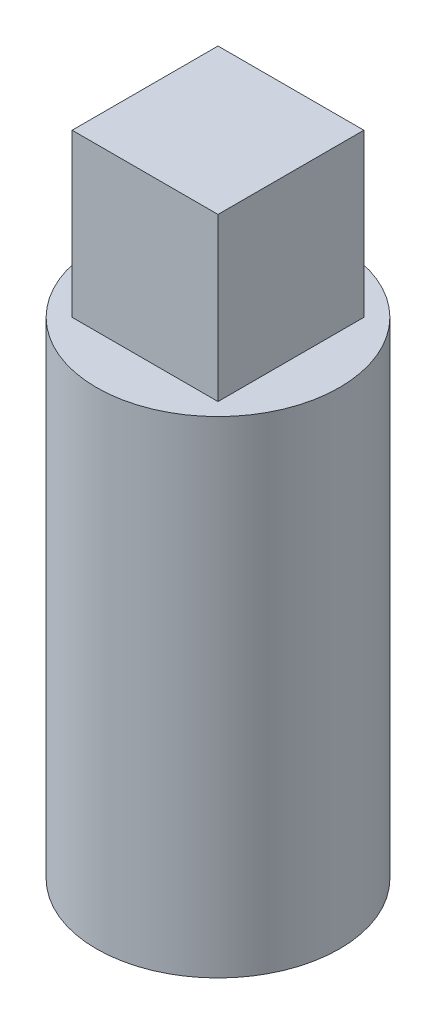
ISO-10303-21;
HEADER;
FILE_DESCRIPTION(('STEP AP214'),'2;1');
FILE_NAME('part.step','',(''),(''),'','','');
FILE_SCHEMA(('AUTOMOTIVE_DESIGN { 1 0 10303 214 1 1 1 1 }'));
ENDSEC;
DATA;
#1=APPLICATION_CONTEXT('core data for automotive mechanical design processes');
#2=APPLICATION_PROTOCOL_DEFINITION('international standard','automotive_design',2000,#1);
#3=PRODUCT_CONTEXT('',#1,'mechanical');
#4=PRODUCT('Part','Part','',(#3));
#5=PRODUCT_RELATED_PRODUCT_CATEGORY('part','',(#4));
#6=PRODUCT_DEFINITION_FORMATION('','',#4);
#7=PRODUCT_DEFINITION_CONTEXT('part definition',#1,'design');
#8=PRODUCT_DEFINITION('design','',#6,#7);
#9=PRODUCT_DEFINITION_SHAPE('','',#8);
#10=(LENGTH_UNIT() NAMED_UNIT(*) SI_UNIT(.MILLI.,.METRE.));
#11=(NAMED_UNIT(*) PLANE_ANGLE_UNIT() SI_UNIT($,.RADIAN.));
#12=(NAMED_UNIT(*) SI_UNIT($,.STERADIAN.) SOLID_ANGLE_UNIT());
#13=UNCERTAINTY_MEASURE_WITH_UNIT(LENGTH_MEASURE(1.E-05),#10,'distance_accuracy_value','');
#14=(GEOMETRIC_REPRESENTATION_CONTEXT(3) GLOBAL_UNCERTAINTY_ASSIGNED_CONTEXT((#13)) GLOBAL_UNIT_ASSIGNED_CONTEXT((#10,
#11,#12)) REPRESENTATION_CONTEXT('',''));
#15=CARTESIAN_POINT('',(0.,0.,0.));
#16=DIRECTION('',(0.,0.,1.));
#17=DIRECTION('',(1.,0.,0.));
#18=AXIS2_PLACEMENT_3D('',#15,#16,#17);
#19=CARTESIAN_POINT('',(0.,6.,0.));
#20=DIRECTION('',(0.,-1.,0.));
#21=DIRECTION('',(0.,0.,-1.));
#22=AXIS2_PLACEMENT_3D('',#19,#20,#21);
#23=CYLINDRICAL_SURFACE('',#22,1.5);
#24=CARTESIAN_POINT('',(0.,6.,0.));
#25=DIRECTION('',(0.,1.,0.));
#26=DIRECTION('',(0.,0.,1.));
#27=AXIS2_PLACEMENT_3D('',#24,#25,#26);
#28=CIRCLE('',#27,1.5);
#29=CARTESIAN_POINT('',(0.,6.,1.5));
#30=VERTEX_POINT('',#29);
#31=EDGE_CURVE('E11',#30,#30,#28,.T.);
#32=ORIENTED_EDGE('',*,*,#31,.F.);
#33=EDGE_LOOP('',(#32));
#34=FACE_BOUND('',#33,.T.);
#35=CARTESIAN_POINT('',(0.,0.,0.));
#36=DIRECTION('',(0.,1.,0.));
#37=DIRECTION('',(0.,0.,1.));
#38=AXIS2_PLACEMENT_3D('',#35,#36,#37);
#39=CIRCLE('',#38,1.5);
#40=CARTESIAN_POINT('',(0.,0.,1.5));
#41=VERTEX_POINT('',#40);
#42=EDGE_CURVE('E50',#41,#41,#39,.T.);
#43=ORIENTED_EDGE('',*,*,#42,.T.);
#44=EDGE_LOOP('',(#43));
#45=FACE_BOUND('',#44,.T.);
#46=ADVANCED_FACE('F47',(#34,#45),#23,.T.);
#47=CARTESIAN_POINT('',(0.,6.,0.));
#48=DIRECTION('',(0.,1.,0.));
#49=DIRECTION('',(0.,0.,1.));
#50=AXIS2_PLACEMENT_3D('',#47,#48,#49);
#51=PLANE('',#50);
#52=DIRECTION('',(1.,0.,0.));
#53=VECTOR('',#52,1.);
#54=CARTESIAN_POINT('',(0.,6.,0.9));
#55=LINE('',#54,#53);
#56=CARTESIAN_POINT('',(-0.9,6.,0.9));
#57=VERTEX_POINT('',#56);
#58=CARTESIAN_POINT('',(0.9,6.,0.9));
#59=VERTEX_POINT('',#58);
#60=EDGE_CURVE('E62',#57,#59,#55,.T.);
#61=ORIENTED_EDGE('',*,*,#60,.F.);
#62=DIRECTION('',(0.,0.,-1.));
#63=VECTOR('',#62,1.);
#64=CARTESIAN_POINT('',(-0.9,6.,0.));
#65=LINE('',#64,#63);
#66=CARTESIAN_POINT('',(-0.9,6.,-0.9));
#67=VERTEX_POINT('',#66);
#68=EDGE_CURVE('E67',#57,#67,#65,.T.);
#69=ORIENTED_EDGE('',*,*,#68,.T.);
#70=DIRECTION('',(-1.,0.,0.));
#71=VECTOR('',#70,1.);
#72=CARTESIAN_POINT('',(0.,6.,-0.9));
#73=LINE('',#72,#71);
#74=CARTESIAN_POINT('',(0.9,6.,-0.9));
#75=VERTEX_POINT('',#74);
#76=EDGE_CURVE('E125',#75,#67,#73,.T.);
#77=ORIENTED_EDGE('',*,*,#76,.F.);
#78=DIRECTION('',(0.,0.,-1.));
#79=VECTOR('',#78,1.);
#80=CARTESIAN_POINT('',(0.9,6.,0.));
#81=LINE('',#80,#79);
#82=EDGE_CURVE('E129',#59,#75,#81,.T.);
#83=ORIENTED_EDGE('',*,*,#82,.F.);
#84=EDGE_LOOP('',(#61,#69,#77,#83));
#85=FACE_BOUND('',#84,.T.);
#86=ORIENTED_EDGE('',*,*,#31,.T.);
#87=EDGE_LOOP('',(#86));
#88=FACE_BOUND('',#87,.T.);
#89=ADVANCED_FACE('F151',(#85,#88),#51,.T.);
#90=CARTESIAN_POINT('',(0.,0.,0.));
#91=DIRECTION('',(0.,1.,0.));
#92=DIRECTION('',(0.,0.,1.));
#93=AXIS2_PLACEMENT_3D('',#90,#91,#92);
#94=PLANE('',#93);
#95=ORIENTED_EDGE('',*,*,#42,.F.);
#96=EDGE_LOOP('',(#95));
#97=FACE_BOUND('',#96,.T.);
#98=ADVANCED_FACE('F157',(#97),#94,.F.);
#99=CARTESIAN_POINT('',(0.,8.,0.9));
#100=DIRECTION('',(0.,0.,-1.));
#101=DIRECTION('',(-1.,0.,0.));
#102=AXIS2_PLACEMENT_3D('',#99,#100,#101);
#103=PLANE('',#102);
#104=ORIENTED_EDGE('',*,*,#60,.T.);
#105=DIRECTION('',(0.,-1.,0.));
#106=VECTOR('',#105,1.);
#107=CARTESIAN_POINT('',(0.9,8.,0.9));
#108=LINE('',#107,#106);
#109=CARTESIAN_POINT('',(0.9,8.,0.9));
#110=VERTEX_POINT('',#109);
#111=EDGE_CURVE('E92',#110,#59,#108,.T.);
#112=ORIENTED_EDGE('',*,*,#111,.F.);
#113=DIRECTION('',(1.,0.,0.));
#114=VECTOR('',#113,1.);
#115=CARTESIAN_POINT('',(0.,8.,0.9));
#116=LINE('',#115,#114);
#117=CARTESIAN_POINT('',(-0.9,8.,0.9));
#118=VERTEX_POINT('',#117);
#119=EDGE_CURVE('E99',#118,#110,#116,.T.);
#120=ORIENTED_EDGE('',*,*,#119,.F.);
#121=DIRECTION('',(0.,-1.,0.));
#122=VECTOR('',#121,1.);
#123=CARTESIAN_POINT('',(-0.9,8.,0.9));
#124=LINE('',#123,#122);
#125=EDGE_CURVE('E120',#118,#57,#124,.T.);
#126=ORIENTED_EDGE('',*,*,#125,.T.);
#127=EDGE_LOOP('',(#104,#112,#120,#126));
#128=FACE_BOUND('',#127,.T.);
#129=ADVANCED_FACE('F109',(#128),#103,.F.);
#130=CARTESIAN_POINT('',(0.9,8.,0.));
#131=DIRECTION('',(-1.,0.,0.));
#132=DIRECTION('',(0.,0.,1.));
#133=AXIS2_PLACEMENT_3D('',#130,#131,#132);
#134=PLANE('',#133);
#135=ORIENTED_EDGE('',*,*,#82,.T.);
#136=DIRECTION('',(0.,-1.,0.));
#137=VECTOR('',#136,1.);
#138=CARTESIAN_POINT('',(0.9,8.,-0.9));
#139=LINE('',#138,#137);
#140=CARTESIAN_POINT('',(0.9,8.,-0.9));
#141=VERTEX_POINT('',#140);
#142=EDGE_CURVE('E94',#141,#75,#139,.T.);
#143=ORIENTED_EDGE('',*,*,#142,.F.);
#144=DIRECTION('',(0.,0.,-1.));
#145=VECTOR('',#144,1.);
#146=CARTESIAN_POINT('',(0.9,8.,0.));
#147=LINE('',#146,#145);
#148=EDGE_CURVE('E87',#110,#141,#147,.T.);
#149=ORIENTED_EDGE('',*,*,#148,.F.);
#150=ORIENTED_EDGE('',*,*,#111,.T.);
#151=EDGE_LOOP('',(#135,#143,#149,#150));
#152=FACE_BOUND('',#151,.T.);
#153=ADVANCED_FACE('F90',(#152),#134,.F.);
#154=CARTESIAN_POINT('',(0.,8.,-0.9));
#155=DIRECTION('',(0.,0.,1.));
#156=DIRECTION('',(1.,0.,0.));
#157=AXIS2_PLACEMENT_3D('',#154,#155,#156);
#158=PLANE('',#157);
#159=ORIENTED_EDGE('',*,*,#76,.T.);
#160=DIRECTION('',(0.,-1.,0.));
#161=VECTOR('',#160,1.);
#162=CARTESIAN_POINT('',(-0.9,8.,-0.9));
#163=LINE('',#162,#161);
#164=CARTESIAN_POINT('',(-0.9,8.,-0.9));
#165=VERTEX_POINT('',#164);
#166=EDGE_CURVE('E115',#165,#67,#163,.T.);
#167=ORIENTED_EDGE('',*,*,#166,.F.);
#168=DIRECTION('',(-1.,0.,0.));
#169=VECTOR('',#168,1.);
#170=CARTESIAN_POINT('',(0.,8.,-0.9));
#171=LINE('',#170,#169);
#172=EDGE_CURVE('E98',#141,#165,#171,.T.);
#173=ORIENTED_EDGE('',*,*,#172,.F.);
#174=ORIENTED_EDGE('',*,*,#142,.T.);
#175=EDGE_LOOP('',(#159,#167,#173,#174));
#176=FACE_BOUND('',#175,.T.);
#177=ADVANCED_FACE('F139',(#176),#158,.F.);
#178=CARTESIAN_POINT('',(-0.9,8.,0.));
#179=DIRECTION('',(-1.,0.,0.));
#180=DIRECTION('',(0.,0.,1.));
#181=AXIS2_PLACEMENT_3D('',#178,#179,#180);
#182=PLANE('',#181);
#183=ORIENTED_EDGE('',*,*,#68,.F.);
#184=ORIENTED_EDGE('',*,*,#125,.F.);
#185=DIRECTION('',(0.,0.,-1.));
#186=VECTOR('',#185,1.);
#187=CARTESIAN_POINT('',(-0.9,8.,0.));
#188=LINE('',#187,#186);
#189=EDGE_CURVE('E105',#118,#165,#188,.T.);
#190=ORIENTED_EDGE('',*,*,#189,.T.);
#191=ORIENTED_EDGE('',*,*,#166,.T.);
#192=EDGE_LOOP('',(#183,#184,#190,#191));
#193=FACE_BOUND('',#192,.T.);
#194=ADVANCED_FACE('F141',(#193),#182,.T.);
#195=CARTESIAN_POINT('',(0.,8.,0.));
#196=DIRECTION('',(0.,1.,0.));
#197=DIRECTION('',(0.,0.,1.));
#198=AXIS2_PLACEMENT_3D('',#195,#196,#197);
#199=PLANE('',#198);
#200=ORIENTED_EDGE('',*,*,#119,.T.);
#201=ORIENTED_EDGE('',*,*,#148,.T.);
#202=ORIENTED_EDGE('',*,*,#172,.T.);
#203=ORIENTED_EDGE('',*,*,#189,.F.);
#204=EDGE_LOOP('',(#200,#201,#202,#203));
#205=FACE_BOUND('',#204,.T.);
#206=ADVANCED_FACE('F103',(#205),#199,.T.);
#207=CLOSED_SHELL('',(#46,#89,#98,#129,#153,#177,#194,#206));
#208=MANIFOLD_SOLID_BREP('B2',#207);
#209=ADVANCED_BREP_SHAPE_REPRESENTATION('',(#18,#208),#14);
#210=SHAPE_DEFINITION_REPRESENTATION(#9,#209);
ENDSEC;
END-ISO-10303-21;
